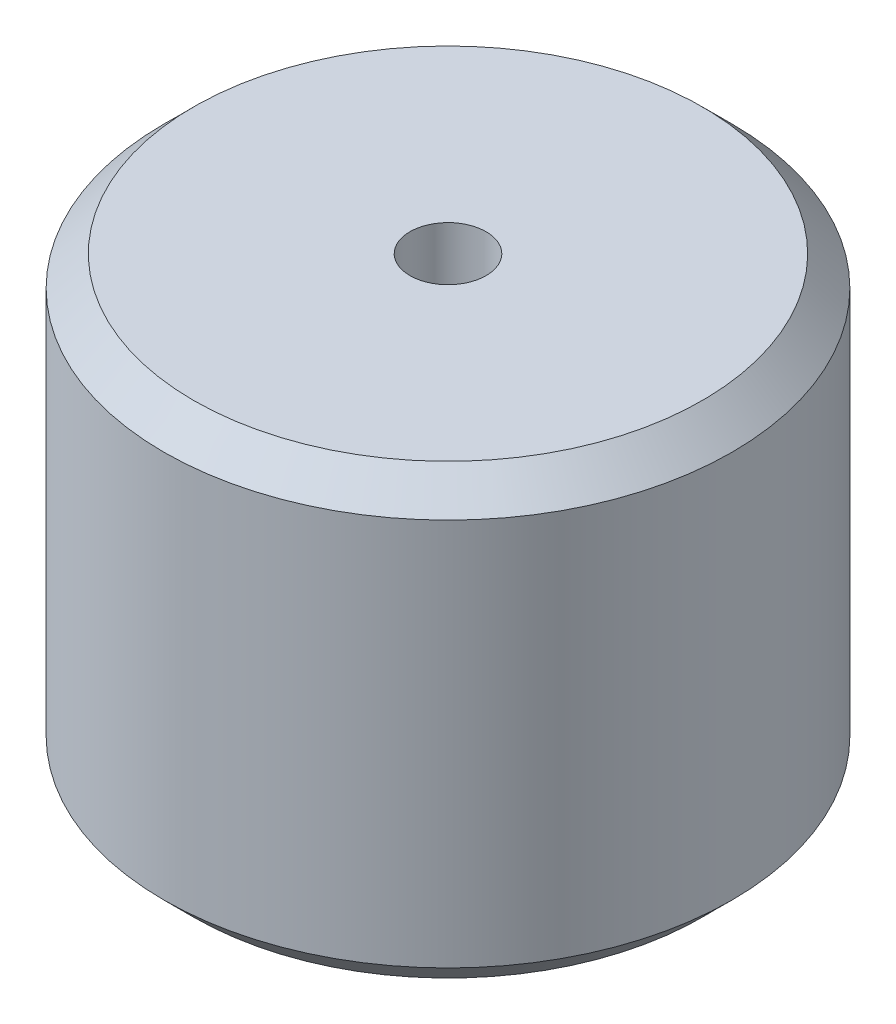
ISO-10303-21;
HEADER;
FILE_DESCRIPTION(('STEP AP214'),'2;1');
FILE_NAME('part.step','',(''),(''),'','','');
FILE_SCHEMA(('AUTOMOTIVE_DESIGN { 1 0 10303 214 1 1 1 1 }'));
ENDSEC;
DATA;
#1=APPLICATION_CONTEXT('core data for automotive mechanical design processes');
#2=APPLICATION_PROTOCOL_DEFINITION('international standard','automotive_design',2000,#1);
#3=PRODUCT_CONTEXT('',#1,'mechanical');
#4=PRODUCT('Part','Part','',(#3));
#5=PRODUCT_RELATED_PRODUCT_CATEGORY('part','',(#4));
#6=PRODUCT_DEFINITION_FORMATION('','',#4);
#7=PRODUCT_DEFINITION_CONTEXT('part definition',#1,'design');
#8=PRODUCT_DEFINITION('design','',#6,#7);
#9=PRODUCT_DEFINITION_SHAPE('','',#8);
#10=(LENGTH_UNIT() NAMED_UNIT(*) SI_UNIT(.MILLI.,.METRE.));
#11=(NAMED_UNIT(*) PLANE_ANGLE_UNIT() SI_UNIT($,.RADIAN.));
#12=(NAMED_UNIT(*) SI_UNIT($,.STERADIAN.) SOLID_ANGLE_UNIT());
#13=UNCERTAINTY_MEASURE_WITH_UNIT(LENGTH_MEASURE(1.E-05),#10,'distance_accuracy_value','');
#14=(GEOMETRIC_REPRESENTATION_CONTEXT(3) GLOBAL_UNCERTAINTY_ASSIGNED_CONTEXT((#13)) GLOBAL_UNIT_ASSIGNED_CONTEXT((#10,
#11,#12)) REPRESENTATION_CONTEXT('',''));
#15=CARTESIAN_POINT('',(0.,0.,0.));
#16=DIRECTION('',(0.,0.,1.));
#17=DIRECTION('',(1.,0.,0.));
#18=AXIS2_PLACEMENT_3D('',#15,#16,#17);
#19=CARTESIAN_POINT('',(0.,30.,0.));
#20=DIRECTION('',(0.,-1.,0.));
#21=DIRECTION('',(0.,0.,-1.));
#22=AXIS2_PLACEMENT_3D('',#19,#20,#21);
#23=CYLINDRICAL_SURFACE('',#22,19.05);
#24=CARTESIAN_POINT('',(0.,2.,0.));
#25=DIRECTION('',(0.,1.,0.));
#26=DIRECTION('',(0.,0.,1.));
#27=AXIS2_PLACEMENT_3D('',#24,#25,#26);
#28=CIRCLE('',#27,19.05);
#29=CARTESIAN_POINT('',(0.,2.,19.05));
#30=VERTEX_POINT('',#29);
#31=EDGE_CURVE('E52',#30,#30,#28,.T.);
#32=ORIENTED_EDGE('',*,*,#31,.T.);
#33=EDGE_LOOP('',(#32));
#34=FACE_BOUND('',#33,.T.);
#35=CARTESIAN_POINT('',(0.,28.,0.));
#36=DIRECTION('',(0.,1.,0.));
#37=DIRECTION('',(0.,0.,1.));
#38=AXIS2_PLACEMENT_3D('',#35,#36,#37);
#39=CIRCLE('',#38,19.05);
#40=CARTESIAN_POINT('',(0.,28.,19.05));
#41=VERTEX_POINT('',#40);
#42=EDGE_CURVE('E69',#41,#41,#39,.F.);
#43=ORIENTED_EDGE('',*,*,#42,.T.);
#44=EDGE_LOOP('',(#43));
#45=FACE_BOUND('',#44,.T.);
#46=ADVANCED_FACE('F44',(#34,#45),#23,.T.);
#47=CARTESIAN_POINT('',(0.,30.,0.));
#48=DIRECTION('',(0.,1.,0.));
#49=DIRECTION('',(0.,0.,1.));
#50=AXIS2_PLACEMENT_3D('',#47,#48,#49);
#51=PLANE('',#50);
#52=CARTESIAN_POINT('',(0.,30.,0.));
#53=DIRECTION('',(0.,1.,0.));
#54=DIRECTION('',(0.,0.,1.));
#55=AXIS2_PLACEMENT_3D('',#52,#53,#54);
#56=CIRCLE('',#55,2.5527);
#57=CARTESIAN_POINT('',(0.,30.,2.5527));
#58=VERTEX_POINT('',#57);
#59=EDGE_CURVE('E66',#58,#58,#56,.T.);
#60=ORIENTED_EDGE('',*,*,#59,.F.);
#61=EDGE_LOOP('',(#60));
#62=FACE_BOUND('',#61,.T.);
#63=CARTESIAN_POINT('',(0.,30.,0.));
#64=DIRECTION('',(0.,1.,0.));
#65=DIRECTION('',(0.,0.,1.));
#66=AXIS2_PLACEMENT_3D('',#63,#64,#65);
#67=CIRCLE('',#66,17.05);
#68=CARTESIAN_POINT('',(0.,30.,17.05));
#69=VERTEX_POINT('',#68);
#70=EDGE_CURVE('E65',#69,#69,#67,.T.);
#71=ORIENTED_EDGE('',*,*,#70,.T.);
#72=EDGE_LOOP('',(#71));
#73=FACE_BOUND('',#72,.T.);
#74=ADVANCED_FACE('F88',(#62,#73),#51,.T.);
#75=CARTESIAN_POINT('',(0.,0.,0.));
#76=DIRECTION('',(0.,1.,0.));
#77=DIRECTION('',(0.,0.,1.));
#78=AXIS2_PLACEMENT_3D('',#75,#76,#77);
#79=PLANE('',#78);
#80=CARTESIAN_POINT('',(0.,0.,0.));
#81=DIRECTION('',(0.,1.,0.));
#82=DIRECTION('',(0.,0.,1.));
#83=AXIS2_PLACEMENT_3D('',#80,#81,#82);
#84=CIRCLE('',#83,17.05);
#85=CARTESIAN_POINT('',(0.,0.,17.05));
#86=VERTEX_POINT('',#85);
#87=EDGE_CURVE('E11',#86,#86,#84,.F.);
#88=ORIENTED_EDGE('',*,*,#87,.T.);
#89=EDGE_LOOP('',(#88));
#90=FACE_BOUND('',#89,.T.);
#91=ADVANCED_FACE('F93',(#90),#79,.F.);
#92=CARTESIAN_POINT('',(0.,30.,0.));
#93=DIRECTION('',(0.,-1.,0.));
#94=DIRECTION('',(0.,0.,-1.));
#95=AXIS2_PLACEMENT_3D('',#92,#93,#94);
#96=CONICAL_SURFACE('',#95,17.05,0.785398163397447);
#97=ORIENTED_EDGE('',*,*,#42,.F.);
#98=EDGE_LOOP('',(#97));
#99=FACE_BOUND('',#98,.T.);
#100=ORIENTED_EDGE('',*,*,#70,.F.);
#101=EDGE_LOOP('',(#100));
#102=FACE_BOUND('',#101,.T.);
#103=ADVANCED_FACE('F59',(#99,#102),#96,.T.);
#104=CARTESIAN_POINT('',(0.,5.,0.));
#105=DIRECTION('',(0.,1.,0.));
#106=DIRECTION('',(0.,0.,1.));
#107=AXIS2_PLACEMENT_3D('',#104,#105,#106);
#108=CONICAL_SURFACE('',#107,2.55269999999999,1.02974425867665);
#109=CARTESIAN_POINT('',(0.,3.46618309780834,0.));
#110=VERTEX_POINT('',#109);
#111=VERTEX_LOOP('',#110);
#112=FACE_BOUND('',#111,.T.);
#113=CARTESIAN_POINT('',(0.,5.,0.));
#114=DIRECTION('',(0.,1.,0.));
#115=DIRECTION('',(0.,0.,1.));
#116=AXIS2_PLACEMENT_3D('',#113,#114,#115);
#117=CIRCLE('',#116,2.55269999999999);
#118=CARTESIAN_POINT('',(0.,5.,2.55269999999999));
#119=VERTEX_POINT('',#118);
#120=EDGE_CURVE('E63',#119,#119,#117,.T.);
#121=ORIENTED_EDGE('',*,*,#120,.T.);
#122=EDGE_LOOP('',(#121));
#123=FACE_BOUND('',#122,.T.);
#124=ADVANCED_FACE('F55',(#112,#123),#108,.F.);
#125=CARTESIAN_POINT('',(0.,30.,0.));
#126=DIRECTION('',(0.,1.,0.));
#127=DIRECTION('',(0.,0.,1.));
#128=AXIS2_PLACEMENT_3D('',#125,#126,#127);
#129=CYLINDRICAL_SURFACE('',#128,2.5527);
#130=ORIENTED_EDGE('',*,*,#120,.F.);
#131=EDGE_LOOP('',(#130));
#132=FACE_BOUND('',#131,.T.);
#133=ORIENTED_EDGE('',*,*,#59,.T.);
#134=EDGE_LOOP('',(#133));
#135=FACE_BOUND('',#134,.T.);
#136=ADVANCED_FACE('F58',(#132,#135),#129,.F.);
#137=CARTESIAN_POINT('',(0.,2.,0.));
#138=DIRECTION('',(0.,1.,0.));
#139=DIRECTION('',(0.,0.,1.));
#140=AXIS2_PLACEMENT_3D('',#137,#138,#139);
#141=CONICAL_SURFACE('',#140,19.05,0.785398163397452);
#142=ORIENTED_EDGE('',*,*,#87,.F.);
#143=EDGE_LOOP('',(#142));
#144=FACE_BOUND('',#143,.T.);
#145=ORIENTED_EDGE('',*,*,#31,.F.);
#146=EDGE_LOOP('',(#145));
#147=FACE_BOUND('',#146,.T.);
#148=ADVANCED_FACE('F47',(#144,#147),#141,.T.);
#149=CLOSED_SHELL('',(#46,#74,#91,#103,#124,#136,#148));
#150=MANIFOLD_SOLID_BREP('B2',#149);
#151=ADVANCED_BREP_SHAPE_REPRESENTATION('',(#18,#150),#14);
#152=SHAPE_DEFINITION_REPRESENTATION(#9,#151);
ENDSEC;
END-ISO-10303-21;
